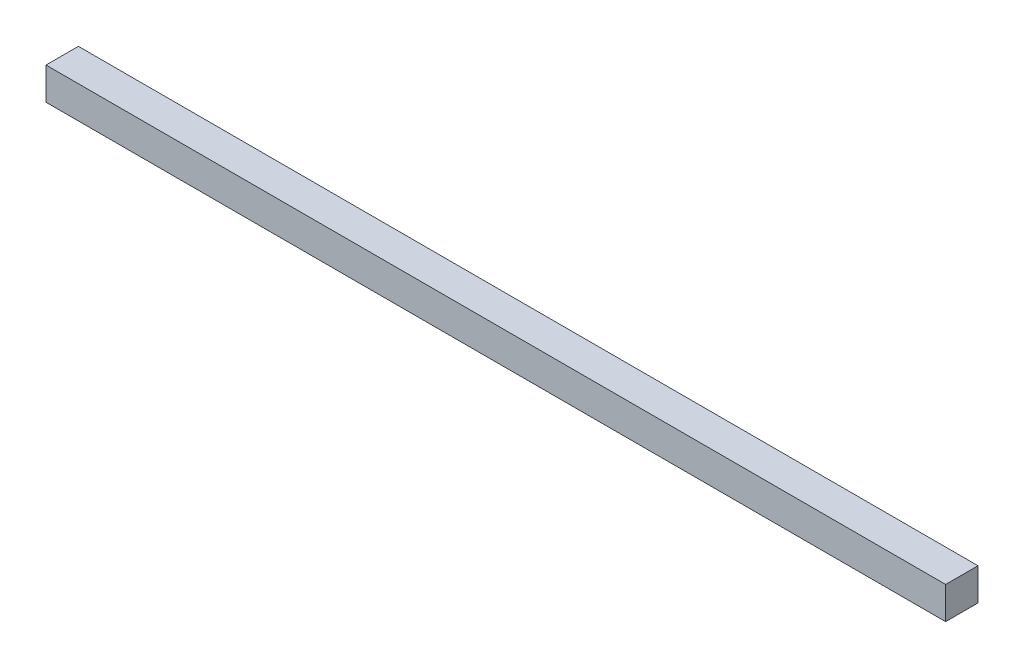
ISO-10303-21;
HEADER;
FILE_DESCRIPTION(('STEP AP214'),'2;1');
FILE_NAME('part.step','',(''),(''),'','','');
FILE_SCHEMA(('AUTOMOTIVE_DESIGN { 1 0 10303 214 1 1 1 1 }'));
ENDSEC;
DATA;
#1=APPLICATION_CONTEXT('core data for automotive mechanical design processes');
#2=APPLICATION_PROTOCOL_DEFINITION('international standard','automotive_design',2000,#1);
#3=PRODUCT_CONTEXT('',#1,'mechanical');
#4=PRODUCT('Part','Part','',(#3));
#5=PRODUCT_RELATED_PRODUCT_CATEGORY('part','',(#4));
#6=PRODUCT_DEFINITION_FORMATION('','',#4);
#7=PRODUCT_DEFINITION_CONTEXT('part definition',#1,'design');
#8=PRODUCT_DEFINITION('design','',#6,#7);
#9=PRODUCT_DEFINITION_SHAPE('','',#8);
#10=(LENGTH_UNIT() NAMED_UNIT(*) SI_UNIT(.MILLI.,.METRE.));
#11=(NAMED_UNIT(*) PLANE_ANGLE_UNIT() SI_UNIT($,.RADIAN.));
#12=(NAMED_UNIT(*) SI_UNIT($,.STERADIAN.) SOLID_ANGLE_UNIT());
#13=UNCERTAINTY_MEASURE_WITH_UNIT(LENGTH_MEASURE(1.E-05),#10,'distance_accuracy_value','');
#14=(GEOMETRIC_REPRESENTATION_CONTEXT(3) GLOBAL_UNCERTAINTY_ASSIGNED_CONTEXT((#13)) GLOBAL_UNIT_ASSIGNED_CONTEXT((#10,
#11,#12)) REPRESENTATION_CONTEXT('',''));
#15=CARTESIAN_POINT('',(0.,0.,0.));
#16=DIRECTION('',(0.,0.,1.));
#17=DIRECTION('',(1.,0.,0.));
#18=AXIS2_PLACEMENT_3D('',#15,#16,#17);
#19=CARTESIAN_POINT('',(-43.5,-5.08141342759184,-5.10070225830867));
#20=DIRECTION('',(0.,0.,-1.));
#21=DIRECTION('',(-1.,0.,0.));
#22=AXIS2_PLACEMENT_3D('',#19,#20,#21);
#23=PLANE('',#22);
#24=DIRECTION('',(1.,0.,0.));
#25=VECTOR('',#24,1.);
#26=CARTESIAN_POINT('',(-43.5,5.08141342759184,-5.10070225830867));
#27=LINE('',#26,#25);
#28=CARTESIAN_POINT('',(-43.5,5.08141342759184,-5.10070225830867));
#29=VERTEX_POINT('',#28);
#30=CARTESIAN_POINT('',(240.,5.08141342759184,-5.10070225830867));
#31=VERTEX_POINT('',#30);
#32=EDGE_CURVE('E44',#29,#31,#27,.T.);
#33=ORIENTED_EDGE('',*,*,#32,.T.);
#34=DIRECTION('',(0.,1.,0.));
#35=VECTOR('',#34,1.);
#36=CARTESIAN_POINT('',(240.,-5.08141342759184,-5.10070225830867));
#37=LINE('',#36,#35);
#38=CARTESIAN_POINT('',(240.,-5.08141342759184,-5.10070225830867));
#39=VERTEX_POINT('',#38);
#40=EDGE_CURVE('E81',#39,#31,#37,.T.);
#41=ORIENTED_EDGE('',*,*,#40,.F.);
#42=DIRECTION('',(1.,0.,0.));
#43=VECTOR('',#42,1.);
#44=CARTESIAN_POINT('',(-43.5,-5.08141342759184,-5.10070225830867));
#45=LINE('',#44,#43);
#46=CARTESIAN_POINT('',(-43.5,-5.08141342759184,-5.10070225830867));
#47=VERTEX_POINT('',#46);
#48=EDGE_CURVE('E11',#47,#39,#45,.T.);
#49=ORIENTED_EDGE('',*,*,#48,.F.);
#50=DIRECTION('',(0.,1.,0.));
#51=VECTOR('',#50,1.);
#52=CARTESIAN_POINT('',(-43.5,-5.08141342759184,-5.10070225830867));
#53=LINE('',#52,#51);
#54=EDGE_CURVE('E82',#47,#29,#53,.T.);
#55=ORIENTED_EDGE('',*,*,#54,.T.);
#56=EDGE_LOOP('',(#33,#41,#49,#55));
#57=FACE_BOUND('',#56,.T.);
#58=ADVANCED_FACE('F41',(#57),#23,.T.);
#59=CARTESIAN_POINT('',(-43.5,-5.08141342759184,5.10070225830867));
#60=DIRECTION('',(0.,-1.,0.));
#61=DIRECTION('',(0.,0.,-1.));
#62=AXIS2_PLACEMENT_3D('',#59,#60,#61);
#63=PLANE('',#62);
#64=ORIENTED_EDGE('',*,*,#48,.T.);
#65=DIRECTION('',(0.,0.,-1.));
#66=VECTOR('',#65,1.);
#67=CARTESIAN_POINT('',(240.,-5.08141342759184,5.10070225830867));
#68=LINE('',#67,#66);
#69=CARTESIAN_POINT('',(240.,-5.08141342759184,5.10070225830867));
#70=VERTEX_POINT('',#69);
#71=EDGE_CURVE('E98',#70,#39,#68,.T.);
#72=ORIENTED_EDGE('',*,*,#71,.F.);
#73=DIRECTION('',(1.,0.,0.));
#74=VECTOR('',#73,1.);
#75=CARTESIAN_POINT('',(-43.5,-5.08141342759184,5.10070225830867));
#76=LINE('',#75,#74);
#77=CARTESIAN_POINT('',(-43.5,-5.08141342759184,5.10070225830867));
#78=VERTEX_POINT('',#77);
#79=EDGE_CURVE('E49',#78,#70,#76,.T.);
#80=ORIENTED_EDGE('',*,*,#79,.F.);
#81=DIRECTION('',(0.,0.,-1.));
#82=VECTOR('',#81,1.);
#83=CARTESIAN_POINT('',(-43.5,-5.08141342759184,5.10070225830867));
#84=LINE('',#83,#82);
#85=EDGE_CURVE('E87',#78,#47,#84,.T.);
#86=ORIENTED_EDGE('',*,*,#85,.T.);
#87=EDGE_LOOP('',(#64,#72,#80,#86));
#88=FACE_BOUND('',#87,.T.);
#89=ADVANCED_FACE('F113',(#88),#63,.T.);
#90=CARTESIAN_POINT('',(-43.5,-5.08141342759184,5.10070225830867));
#91=DIRECTION('',(0.,0.,1.));
#92=DIRECTION('',(1.,0.,0.));
#93=AXIS2_PLACEMENT_3D('',#90,#91,#92);
#94=PLANE('',#93);
#95=ORIENTED_EDGE('',*,*,#79,.T.);
#96=DIRECTION('',(0.,-1.,0.));
#97=VECTOR('',#96,1.);
#98=CARTESIAN_POINT('',(240.,-5.08141342759184,5.10070225830867));
#99=LINE('',#98,#97);
#100=CARTESIAN_POINT('',(240.,5.08141342759184,5.10070225830867));
#101=VERTEX_POINT('',#100);
#102=EDGE_CURVE('E94',#101,#70,#99,.T.);
#103=ORIENTED_EDGE('',*,*,#102,.F.);
#104=DIRECTION('',(1.,0.,0.));
#105=VECTOR('',#104,1.);
#106=CARTESIAN_POINT('',(-43.5,5.08141342759184,5.10070225830867));
#107=LINE('',#106,#105);
#108=CARTESIAN_POINT('',(-43.5,5.08141342759184,5.10070225830867));
#109=VERTEX_POINT('',#108);
#110=EDGE_CURVE('E86',#109,#101,#107,.T.);
#111=ORIENTED_EDGE('',*,*,#110,.F.);
#112=DIRECTION('',(0.,-1.,0.));
#113=VECTOR('',#112,1.);
#114=CARTESIAN_POINT('',(-43.5,-5.08141342759184,5.10070225830867));
#115=LINE('',#114,#113);
#116=EDGE_CURVE('E106',#109,#78,#115,.T.);
#117=ORIENTED_EDGE('',*,*,#116,.T.);
#118=EDGE_LOOP('',(#95,#103,#111,#117));
#119=FACE_BOUND('',#118,.T.);
#120=ADVANCED_FACE('F110',(#119),#94,.T.);
#121=CARTESIAN_POINT('',(-43.5,5.08141342759184,5.10070225830867));
#122=DIRECTION('',(0.,1.,0.));
#123=DIRECTION('',(0.,0.,1.));
#124=AXIS2_PLACEMENT_3D('',#121,#122,#123);
#125=PLANE('',#124);
#126=ORIENTED_EDGE('',*,*,#110,.T.);
#127=DIRECTION('',(0.,0.,1.));
#128=VECTOR('',#127,1.);
#129=CARTESIAN_POINT('',(240.,5.08141342759184,5.10070225830867));
#130=LINE('',#129,#128);
#131=EDGE_CURVE('E89',#31,#101,#130,.T.);
#132=ORIENTED_EDGE('',*,*,#131,.F.);
#133=ORIENTED_EDGE('',*,*,#32,.F.);
#134=DIRECTION('',(0.,0.,1.));
#135=VECTOR('',#134,1.);
#136=CARTESIAN_POINT('',(-43.5,5.08141342759184,5.10070225830867));
#137=LINE('',#136,#135);
#138=EDGE_CURVE('E104',#29,#109,#137,.T.);
#139=ORIENTED_EDGE('',*,*,#138,.T.);
#140=EDGE_LOOP('',(#126,#132,#133,#139));
#141=FACE_BOUND('',#140,.T.);
#142=ADVANCED_FACE('F90',(#141),#125,.T.);
#143=CARTESIAN_POINT('',(-43.5,0.,0.));
#144=DIRECTION('',(-1.,0.,0.));
#145=DIRECTION('',(0.,0.,1.));
#146=AXIS2_PLACEMENT_3D('',#143,#144,#145);
#147=PLANE('',#146);
#148=ORIENTED_EDGE('',*,*,#54,.F.);
#149=ORIENTED_EDGE('',*,*,#85,.F.);
#150=ORIENTED_EDGE('',*,*,#116,.F.);
#151=ORIENTED_EDGE('',*,*,#138,.F.);
#152=EDGE_LOOP('',(#148,#149,#150,#151));
#153=FACE_BOUND('',#152,.T.);
#154=ADVANCED_FACE('F115',(#153),#147,.T.);
#155=CARTESIAN_POINT('',(240.,0.,0.));
#156=DIRECTION('',(-1.,0.,0.));
#157=DIRECTION('',(0.,0.,1.));
#158=AXIS2_PLACEMENT_3D('',#155,#156,#157);
#159=PLANE('',#158);
#160=ORIENTED_EDGE('',*,*,#40,.T.);
#161=ORIENTED_EDGE('',*,*,#131,.T.);
#162=ORIENTED_EDGE('',*,*,#102,.T.);
#163=ORIENTED_EDGE('',*,*,#71,.T.);
#164=EDGE_LOOP('',(#160,#161,#162,#163));
#165=FACE_BOUND('',#164,.T.);
#166=ADVANCED_FACE('F97',(#165),#159,.F.);
#167=CLOSED_SHELL('',(#58,#89,#120,#142,#154,#166));
#168=MANIFOLD_SOLID_BREP('B2',#167);
#169=ADVANCED_BREP_SHAPE_REPRESENTATION('',(#18,#168),#14);
#170=SHAPE_DEFINITION_REPRESENTATION(#9,#169);
ENDSEC;
END-ISO-10303-21;
